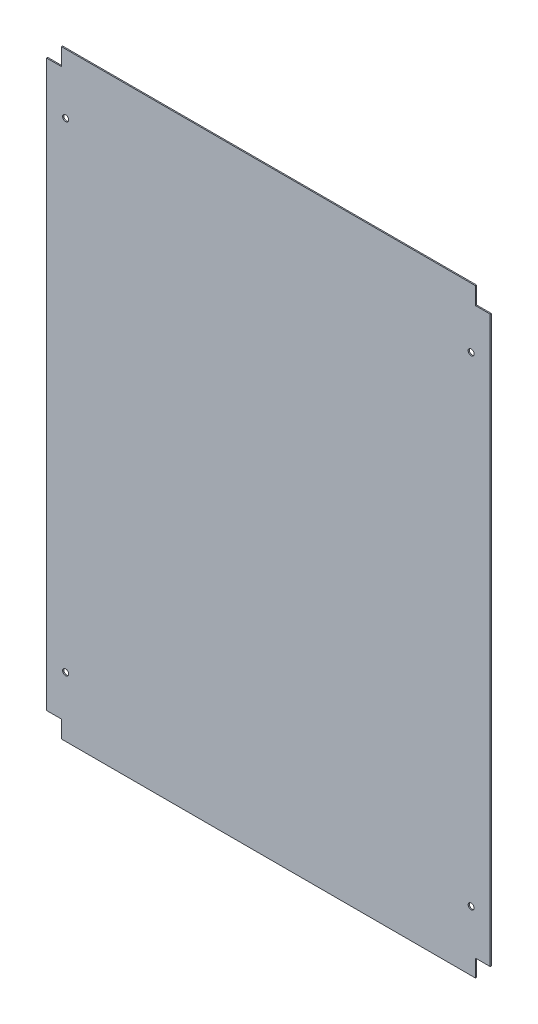
ISO-10303-21;
HEADER;
FILE_DESCRIPTION(('STEP AP214'),'2;1');
FILE_NAME('part.step','',(''),(''),'','','');
FILE_SCHEMA(('AUTOMOTIVE_DESIGN { 1 0 10303 214 1 1 1 1 }'));
ENDSEC;
DATA;
#1=APPLICATION_CONTEXT('core data for automotive mechanical design processes');
#2=APPLICATION_PROTOCOL_DEFINITION('international standard','automotive_design',2000,#1);
#3=PRODUCT_CONTEXT('',#1,'mechanical');
#4=PRODUCT('Part','Part','',(#3));
#5=PRODUCT_RELATED_PRODUCT_CATEGORY('part','',(#4));
#6=PRODUCT_DEFINITION_FORMATION('','',#4);
#7=PRODUCT_DEFINITION_CONTEXT('part definition',#1,'design');
#8=PRODUCT_DEFINITION('design','',#6,#7);
#9=PRODUCT_DEFINITION_SHAPE('','',#8);
#10=(LENGTH_UNIT() NAMED_UNIT(*) SI_UNIT(.MILLI.,.METRE.));
#11=(NAMED_UNIT(*) PLANE_ANGLE_UNIT() SI_UNIT($,.RADIAN.));
#12=(NAMED_UNIT(*) SI_UNIT($,.STERADIAN.) SOLID_ANGLE_UNIT());
#13=UNCERTAINTY_MEASURE_WITH_UNIT(LENGTH_MEASURE(1.E-05),#10,'distance_accuracy_value','');
#14=(GEOMETRIC_REPRESENTATION_CONTEXT(3) GLOBAL_UNCERTAINTY_ASSIGNED_CONTEXT((#13)) GLOBAL_UNIT_ASSIGNED_CONTEXT((#10,
#11,#12)) REPRESENTATION_CONTEXT('',''));
#15=CARTESIAN_POINT('',(0.,0.,0.));
#16=DIRECTION('',(0.,0.,1.));
#17=DIRECTION('',(1.,0.,0.));
#18=AXIS2_PLACEMENT_3D('',#15,#16,#17);
#19=CARTESIAN_POINT('',(0.,0.,-1.524));
#20=DIRECTION('',(0.,0.,-1.));
#21=DIRECTION('',(-1.,0.,0.));
#22=AXIS2_PLACEMENT_3D('',#19,#20,#21);
#23=PLANE('',#22);
#24=CARTESIAN_POINT('',(268.224,317.5,-1.524));
#25=DIRECTION('',(0.,0.,-1.));
#26=DIRECTION('',(-1.,0.,0.));
#27=AXIS2_PLACEMENT_3D('',#24,#25,#26);
#28=CIRCLE('',#27,3.9624);
#29=CARTESIAN_POINT('',(264.2616,317.5,-1.524));
#30=VERTEX_POINT('',#29);
#31=EDGE_CURVE('E385',#30,#30,#28,.T.);
#32=ORIENTED_EDGE('',*,*,#31,.F.);
#33=EDGE_LOOP('',(#32));
#34=FACE_BOUND('',#33,.T.);
#35=CARTESIAN_POINT('',(-268.351,-317.5,-1.524));
#36=DIRECTION('',(0.,0.,-1.));
#37=DIRECTION('',(-1.,0.,0.));
#38=AXIS2_PLACEMENT_3D('',#35,#36,#37);
#39=CIRCLE('',#38,3.9624);
#40=CARTESIAN_POINT('',(-272.3134,-317.5,-1.524));
#41=VERTEX_POINT('',#40);
#42=EDGE_CURVE('E381',#41,#41,#39,.T.);
#43=ORIENTED_EDGE('',*,*,#42,.F.);
#44=EDGE_LOOP('',(#43));
#45=FACE_BOUND('',#44,.T.);
#46=CARTESIAN_POINT('',(268.224,-317.5,-1.524));
#47=DIRECTION('',(0.,0.,-1.));
#48=DIRECTION('',(-1.,0.,0.));
#49=AXIS2_PLACEMENT_3D('',#46,#47,#48);
#50=CIRCLE('',#49,3.9624);
#51=CARTESIAN_POINT('',(264.2616,-317.5,-1.524));
#52=VERTEX_POINT('',#51);
#53=EDGE_CURVE('E377',#52,#52,#50,.T.);
#54=ORIENTED_EDGE('',*,*,#53,.F.);
#55=EDGE_LOOP('',(#54));
#56=FACE_BOUND('',#55,.T.);
#57=CARTESIAN_POINT('',(-268.351,317.5,-1.524));
#58=DIRECTION('',(0.,0.,-1.));
#59=DIRECTION('',(-1.,0.,0.));
#60=AXIS2_PLACEMENT_3D('',#57,#58,#59);
#61=CIRCLE('',#60,3.9624);
#62=CARTESIAN_POINT('',(-272.3134,317.5,-1.524));
#63=VERTEX_POINT('',#62);
#64=EDGE_CURVE('E373',#63,#63,#61,.T.);
#65=ORIENTED_EDGE('',*,*,#64,.F.);
#66=EDGE_LOOP('',(#65));
#67=FACE_BOUND('',#66,.T.);
#68=DIRECTION('',(0.,-1.,0.));
#69=VECTOR('',#68,1.);
#70=CARTESIAN_POINT('',(273.8628,-380.238,-1.524));
#71=LINE('',#70,#69);
#72=CARTESIAN_POINT('',(273.8628,-374.0404,-1.524));
#73=VERTEX_POINT('',#72);
#74=CARTESIAN_POINT('',(273.8628,-396.734962531012,-1.52399999999991));
#75=VERTEX_POINT('',#74);
#76=EDGE_CURVE('E464',#73,#75,#71,.T.);
#77=ORIENTED_EDGE('',*,*,#76,.T.);
#78=DIRECTION('',(-1.,0.,0.));
#79=VECTOR('',#78,1.);
#80=CARTESIAN_POINT('',(273.8628,-396.734962531012,-1.52399999999991));
#81=LINE('',#80,#79);
#82=CARTESIAN_POINT('',(-273.8628,-396.734962531012,-1.52399999999991));
#83=VERTEX_POINT('',#82);
#84=EDGE_CURVE('E330',#83,#75,#81,.F.);
#85=ORIENTED_EDGE('',*,*,#84,.F.);
#86=DIRECTION('',(0.,1.,0.));
#87=VECTOR('',#86,1.);
#88=CARTESIAN_POINT('',(-273.8628,-380.238,-1.524));
#89=LINE('',#88,#87);
#90=CARTESIAN_POINT('',(-273.8628,-374.0404,-1.524));
#91=VERTEX_POINT('',#90);
#92=EDGE_CURVE('E480',#83,#91,#89,.T.);
#93=ORIENTED_EDGE('',*,*,#92,.T.);
#94=DIRECTION('',(-1.,0.,0.));
#95=VECTOR('',#94,1.);
#96=CARTESIAN_POINT('',(-273.7866,-374.0404,-1.52400000000003));
#97=LINE('',#96,#95);
#98=CARTESIAN_POINT('',(-273.7866,-374.0404,-1.524));
#99=VERTEX_POINT('',#98);
#100=EDGE_CURVE('E403',#99,#91,#97,.T.);
#101=ORIENTED_EDGE('',*,*,#100,.F.);
#102=DIRECTION('',(0.,-1.,0.));
#103=VECTOR('',#102,1.);
#104=CARTESIAN_POINT('',(-273.7866,-373.888,-1.52400000000003));
#105=LINE('',#104,#103);
#106=CARTESIAN_POINT('',(-273.7866,-373.888,-1.524));
#107=VERTEX_POINT('',#106);
#108=EDGE_CURVE('E397',#107,#99,#105,.T.);
#109=ORIENTED_EDGE('',*,*,#108,.F.);
#110=DIRECTION('',(-1.,0.,0.));
#111=VECTOR('',#110,1.);
#112=CARTESIAN_POINT('',(-276.987,-373.888,-1.524));
#113=LINE('',#112,#111);
#114=CARTESIAN_POINT('',(-293.483962531012,-373.888,-1.52399999999991));
#115=VERTEX_POINT('',#114);
#116=EDGE_CURVE('E483',#107,#115,#113,.T.);
#117=ORIENTED_EDGE('',*,*,#116,.T.);
#118=DIRECTION('',(0.,1.,0.));
#119=VECTOR('',#118,1.);
#120=CARTESIAN_POINT('',(-293.483962531012,-373.888,-1.52399999999991));
#121=LINE('',#120,#119);
#122=CARTESIAN_POINT('',(-293.483962531012,373.888,-1.5239999999998));
#123=VERTEX_POINT('',#122);
#124=EDGE_CURVE('E313',#123,#115,#121,.F.);
#125=ORIENTED_EDGE('',*,*,#124,.F.);
#126=DIRECTION('',(1.,0.,0.));
#127=VECTOR('',#126,1.);
#128=CARTESIAN_POINT('',(-276.987,373.888,-1.524));
#129=LINE('',#128,#127);
#130=CARTESIAN_POINT('',(-273.7866,373.888,-1.524));
#131=VERTEX_POINT('',#130);
#132=EDGE_CURVE('E160',#123,#131,#129,.T.);
#133=ORIENTED_EDGE('',*,*,#132,.T.);
#134=DIRECTION('',(0.,-1.,0.));
#135=VECTOR('',#134,1.);
#136=CARTESIAN_POINT('',(-273.7866,374.0404,-1.52400000000003));
#137=LINE('',#136,#135);
#138=CARTESIAN_POINT('',(-273.7866,374.0404,-1.524));
#139=VERTEX_POINT('',#138);
#140=EDGE_CURVE('E155',#139,#131,#137,.T.);
#141=ORIENTED_EDGE('',*,*,#140,.F.);
#142=DIRECTION('',(1.,0.,0.));
#143=VECTOR('',#142,1.);
#144=CARTESIAN_POINT('',(-276.987,374.0404,-1.52400000000003));
#145=LINE('',#144,#143);
#146=CARTESIAN_POINT('',(-273.8628,374.0404,-1.524));
#147=VERTEX_POINT('',#146);
#148=EDGE_CURVE('E390',#147,#139,#145,.T.);
#149=ORIENTED_EDGE('',*,*,#148,.F.);
#150=DIRECTION('',(0.,1.,0.));
#151=VECTOR('',#150,1.);
#152=CARTESIAN_POINT('',(-273.8628,380.238,-1.524));
#153=LINE('',#152,#151);
#154=CARTESIAN_POINT('',(-273.8628,396.734962531012,-1.52399999999986));
#155=VERTEX_POINT('',#154);
#156=EDGE_CURVE('E292',#147,#155,#153,.T.);
#157=ORIENTED_EDGE('',*,*,#156,.T.);
#158=DIRECTION('',(1.,0.,0.));
#159=VECTOR('',#158,1.);
#160=CARTESIAN_POINT('',(-273.8628,396.734962531012,-1.52399999999986));
#161=LINE('',#160,#159);
#162=CARTESIAN_POINT('',(273.8628,396.734962531012,-1.52399999999986));
#163=VERTEX_POINT('',#162);
#164=EDGE_CURVE('E290',#163,#155,#161,.F.);
#165=ORIENTED_EDGE('',*,*,#164,.F.);
#166=DIRECTION('',(0.,-1.,0.));
#167=VECTOR('',#166,1.);
#168=CARTESIAN_POINT('',(273.8628,380.238,-1.524));
#169=LINE('',#168,#167);
#170=CARTESIAN_POINT('',(273.8628,374.0404,-1.52399999999998));
#171=VERTEX_POINT('',#170);
#172=EDGE_CURVE('E277',#163,#171,#169,.T.);
#173=ORIENTED_EDGE('',*,*,#172,.T.);
#174=DIRECTION('',(1.,0.,0.));
#175=VECTOR('',#174,1.);
#176=CARTESIAN_POINT('',(273.7866,374.0404,-1.52399999999998));
#177=LINE('',#176,#175);
#178=CARTESIAN_POINT('',(273.7866,374.0404,-1.52399999999998));
#179=VERTEX_POINT('',#178);
#180=EDGE_CURVE('E443',#179,#171,#177,.T.);
#181=ORIENTED_EDGE('',*,*,#180,.F.);
#182=DIRECTION('',(0.,1.,0.));
#183=VECTOR('',#182,1.);
#184=CARTESIAN_POINT('',(273.7866,373.888,-1.52399999999998));
#185=LINE('',#184,#183);
#186=CARTESIAN_POINT('',(273.7866,373.888,-1.52399999999998));
#187=VERTEX_POINT('',#186);
#188=EDGE_CURVE('E437',#187,#179,#185,.T.);
#189=ORIENTED_EDGE('',*,*,#188,.F.);
#190=DIRECTION('',(1.,0.,0.));
#191=VECTOR('',#190,1.);
#192=CARTESIAN_POINT('',(276.987,373.888,-1.524));
#193=LINE('',#192,#191);
#194=CARTESIAN_POINT('',(293.483962531012,373.888,-1.52399999999986));
#195=VERTEX_POINT('',#194);
#196=EDGE_CURVE('E286',#187,#195,#193,.T.);
#197=ORIENTED_EDGE('',*,*,#196,.T.);
#198=DIRECTION('',(0.,-1.,0.));
#199=VECTOR('',#198,1.);
#200=CARTESIAN_POINT('',(293.483962531012,373.888,-1.52399999999986));
#201=LINE('',#200,#199);
#202=CARTESIAN_POINT('',(293.483962531012,-373.888,-1.52399999999986));
#203=VERTEX_POINT('',#202);
#204=EDGE_CURVE('E322',#203,#195,#201,.F.);
#205=ORIENTED_EDGE('',*,*,#204,.F.);
#206=DIRECTION('',(-1.,0.,0.));
#207=VECTOR('',#206,1.);
#208=CARTESIAN_POINT('',(276.987,-373.888,-1.524));
#209=LINE('',#208,#207);
#210=CARTESIAN_POINT('',(273.7866,-373.888,-1.524));
#211=VERTEX_POINT('',#210);
#212=EDGE_CURVE('E492',#203,#211,#209,.T.);
#213=ORIENTED_EDGE('',*,*,#212,.T.);
#214=DIRECTION('',(0.,1.,0.));
#215=VECTOR('',#214,1.);
#216=CARTESIAN_POINT('',(273.7866,-374.0404,-1.52399999999998));
#217=LINE('',#216,#215);
#218=CARTESIAN_POINT('',(273.7866,-374.0404,-1.524));
#219=VERTEX_POINT('',#218);
#220=EDGE_CURVE('E432',#219,#211,#217,.T.);
#221=ORIENTED_EDGE('',*,*,#220,.F.);
#222=DIRECTION('',(-1.,0.,0.));
#223=VECTOR('',#222,1.);
#224=CARTESIAN_POINT('',(276.987,-374.0404,-1.52399999999998));
#225=LINE('',#224,#223);
#226=EDGE_CURVE('E427',#73,#219,#225,.T.);
#227=ORIENTED_EDGE('',*,*,#226,.F.);
#228=EDGE_LOOP('',(#77,#85,#93,#101,#109,#117,#125,#133,#141,#149,#157,#165,#173,#181,#189,#197,
#205,#213,#221,#227));
#229=FACE_BOUND('',#228,.T.);
#230=ADVANCED_FACE('F139',(#34,#45,#56,#67,#229),#23,.T.);
#231=CARTESIAN_POINT('',(0.,0.,0.));
#232=DIRECTION('',(0.,0.,-1.));
#233=DIRECTION('',(-1.,0.,0.));
#234=AXIS2_PLACEMENT_3D('',#231,#232,#233);
#235=PLANE('',#234);
#236=CARTESIAN_POINT('',(268.224,317.5,0.));
#237=DIRECTION('',(0.,0.,1.));
#238=DIRECTION('',(1.,0.,0.));
#239=AXIS2_PLACEMENT_3D('',#236,#237,#238);
#240=CIRCLE('',#239,3.9624);
#241=CARTESIAN_POINT('',(272.1864,317.5,0.));
#242=VERTEX_POINT('',#241);
#243=EDGE_CURVE('E362',#242,#242,#240,.T.);
#244=ORIENTED_EDGE('',*,*,#243,.F.);
#245=EDGE_LOOP('',(#244));
#246=FACE_BOUND('',#245,.T.);
#247=CARTESIAN_POINT('',(-268.351,-317.5,0.));
#248=DIRECTION('',(0.,0.,1.));
#249=DIRECTION('',(1.,0.,0.));
#250=AXIS2_PLACEMENT_3D('',#247,#248,#249);
#251=CIRCLE('',#250,3.9624);
#252=CARTESIAN_POINT('',(-264.3886,-317.5,0.));
#253=VERTEX_POINT('',#252);
#254=EDGE_CURVE('E361',#253,#253,#251,.T.);
#255=ORIENTED_EDGE('',*,*,#254,.F.);
#256=EDGE_LOOP('',(#255));
#257=FACE_BOUND('',#256,.T.);
#258=CARTESIAN_POINT('',(268.224,-317.5,0.));
#259=DIRECTION('',(0.,0.,1.));
#260=DIRECTION('',(1.,0.,0.));
#261=AXIS2_PLACEMENT_3D('',#258,#259,#260);
#262=CIRCLE('',#261,3.9624);
#263=CARTESIAN_POINT('',(272.1864,-317.5,0.));
#264=VERTEX_POINT('',#263);
#265=EDGE_CURVE('E346',#264,#264,#262,.T.);
#266=ORIENTED_EDGE('',*,*,#265,.F.);
#267=EDGE_LOOP('',(#266));
#268=FACE_BOUND('',#267,.T.);
#269=CARTESIAN_POINT('',(-268.351,317.5,0.));
#270=DIRECTION('',(0.,0.,1.));
#271=DIRECTION('',(1.,0.,0.));
#272=AXIS2_PLACEMENT_3D('',#269,#270,#271);
#273=CIRCLE('',#272,3.9624);
#274=CARTESIAN_POINT('',(-264.3886,317.5,0.));
#275=VERTEX_POINT('',#274);
#276=EDGE_CURVE('E366',#275,#275,#273,.T.);
#277=ORIENTED_EDGE('',*,*,#276,.F.);
#278=EDGE_LOOP('',(#277));
#279=FACE_BOUND('',#278,.T.);
#280=DIRECTION('',(0.,1.,0.));
#281=VECTOR('',#280,1.);
#282=CARTESIAN_POINT('',(-273.8628,-380.238,0.));
#283=LINE('',#282,#281);
#284=CARTESIAN_POINT('',(-273.8628,-396.734962531012,1.11022302462516E-13));
#285=VERTEX_POINT('',#284);
#286=CARTESIAN_POINT('',(-273.8628,-374.0404,0.));
#287=VERTEX_POINT('',#286);
#288=EDGE_CURVE('E474',#285,#287,#283,.T.);
#289=ORIENTED_EDGE('',*,*,#288,.F.);
#290=DIRECTION('',(1.,0.,0.));
#291=VECTOR('',#290,1.);
#292=CARTESIAN_POINT('',(0.,-396.734962531012,1.11022302462516E-13));
#293=LINE('',#292,#291);
#294=CARTESIAN_POINT('',(273.8628,-396.734962531012,1.11022302462516E-13));
#295=VERTEX_POINT('',#294);
#296=EDGE_CURVE('E342',#285,#295,#293,.T.);
#297=ORIENTED_EDGE('',*,*,#296,.T.);
#298=DIRECTION('',(0.,-1.,0.));
#299=VECTOR('',#298,1.);
#300=CARTESIAN_POINT('',(273.8628,-380.238,0.));
#301=LINE('',#300,#299);
#302=CARTESIAN_POINT('',(273.8628,-374.0404,0.));
#303=VERTEX_POINT('',#302);
#304=EDGE_CURVE('E489',#303,#295,#301,.T.);
#305=ORIENTED_EDGE('',*,*,#304,.F.);
#306=DIRECTION('',(1.,0.,0.));
#307=VECTOR('',#306,1.);
#308=CARTESIAN_POINT('',(0.,-374.0404,0.));
#309=LINE('',#308,#307);
#310=CARTESIAN_POINT('',(273.7866,-374.0404,0.));
#311=VERTEX_POINT('',#310);
#312=EDGE_CURVE('E431',#311,#303,#309,.T.);
#313=ORIENTED_EDGE('',*,*,#312,.F.);
#314=DIRECTION('',(0.,-1.,0.));
#315=VECTOR('',#314,1.);
#316=CARTESIAN_POINT('',(273.7866,0.,0.));
#317=LINE('',#316,#315);
#318=CARTESIAN_POINT('',(273.7866,-373.888,0.));
#319=VERTEX_POINT('',#318);
#320=EDGE_CURVE('E515',#319,#311,#317,.T.);
#321=ORIENTED_EDGE('',*,*,#320,.F.);
#322=DIRECTION('',(-1.,0.,0.));
#323=VECTOR('',#322,1.);
#324=CARTESIAN_POINT('',(276.987,-373.888,0.));
#325=LINE('',#324,#323);
#326=CARTESIAN_POINT('',(293.483962531012,-373.888,1.66533453693773E-13));
#327=VERTEX_POINT('',#326);
#328=EDGE_CURVE('E486',#327,#319,#325,.T.);
#329=ORIENTED_EDGE('',*,*,#328,.F.);
#330=DIRECTION('',(0.,1.,0.));
#331=VECTOR('',#330,1.);
#332=CARTESIAN_POINT('',(293.483962531012,0.,1.66533453693773E-13));
#333=LINE('',#332,#331);
#334=CARTESIAN_POINT('',(293.483962531012,373.888,1.66533453693773E-13));
#335=VERTEX_POINT('',#334);
#336=EDGE_CURVE('E309',#327,#335,#333,.T.);
#337=ORIENTED_EDGE('',*,*,#336,.T.);
#338=DIRECTION('',(1.,0.,0.));
#339=VECTOR('',#338,1.);
#340=CARTESIAN_POINT('',(276.987,373.888,0.));
#341=LINE('',#340,#339);
#342=CARTESIAN_POINT('',(273.7866,373.888,0.));
#343=VERTEX_POINT('',#342);
#344=EDGE_CURVE('E287',#343,#335,#341,.T.);
#345=ORIENTED_EDGE('',*,*,#344,.F.);
#346=DIRECTION('',(0.,-1.,0.));
#347=VECTOR('',#346,1.);
#348=CARTESIAN_POINT('',(273.7866,0.,0.));
#349=LINE('',#348,#347);
#350=CARTESIAN_POINT('',(273.7866,374.0404,0.));
#351=VERTEX_POINT('',#350);
#352=EDGE_CURVE('E511',#351,#343,#349,.T.);
#353=ORIENTED_EDGE('',*,*,#352,.F.);
#354=DIRECTION('',(-1.,0.,0.));
#355=VECTOR('',#354,1.);
#356=CARTESIAN_POINT('',(0.,374.0404,0.));
#357=LINE('',#356,#355);
#358=CARTESIAN_POINT('',(273.8628,374.0404,0.));
#359=VERTEX_POINT('',#358);
#360=EDGE_CURVE('E461',#359,#351,#357,.T.);
#361=ORIENTED_EDGE('',*,*,#360,.F.);
#362=DIRECTION('',(0.,-1.,0.));
#363=VECTOR('',#362,1.);
#364=CARTESIAN_POINT('',(273.8628,380.238,0.));
#365=LINE('',#364,#363);
#366=CARTESIAN_POINT('',(273.8628,396.734962531012,1.66533453693773E-13));
#367=VERTEX_POINT('',#366);
#368=EDGE_CURVE('E471',#367,#359,#365,.T.);
#369=ORIENTED_EDGE('',*,*,#368,.F.);
#370=DIRECTION('',(-1.,0.,0.));
#371=VECTOR('',#370,1.);
#372=CARTESIAN_POINT('',(0.,396.734962531012,1.66533453693773E-13));
#373=LINE('',#372,#371);
#374=CARTESIAN_POINT('',(-273.8628,396.734962531012,1.66533453693773E-13));
#375=VERTEX_POINT('',#374);
#376=EDGE_CURVE('E301',#367,#375,#373,.T.);
#377=ORIENTED_EDGE('',*,*,#376,.T.);
#378=DIRECTION('',(0.,1.,0.));
#379=VECTOR('',#378,1.);
#380=CARTESIAN_POINT('',(-273.8628,380.238,0.));
#381=LINE('',#380,#379);
#382=CARTESIAN_POINT('',(-273.8628,374.0404,0.));
#383=VERTEX_POINT('',#382);
#384=EDGE_CURVE('E465',#383,#375,#381,.T.);
#385=ORIENTED_EDGE('',*,*,#384,.F.);
#386=DIRECTION('',(-1.,0.,0.));
#387=VECTOR('',#386,1.);
#388=CARTESIAN_POINT('',(0.,374.0404,0.));
#389=LINE('',#388,#387);
#390=CARTESIAN_POINT('',(-273.7866,374.0404,0.));
#391=VERTEX_POINT('',#390);
#392=EDGE_CURVE('E422',#391,#383,#389,.T.);
#393=ORIENTED_EDGE('',*,*,#392,.F.);
#394=DIRECTION('',(0.,1.,0.));
#395=VECTOR('',#394,1.);
#396=CARTESIAN_POINT('',(-273.7866,0.,0.));
#397=LINE('',#396,#395);
#398=CARTESIAN_POINT('',(-273.7866,373.888,0.));
#399=VERTEX_POINT('',#398);
#400=EDGE_CURVE('E13',#399,#391,#397,.T.);
#401=ORIENTED_EDGE('',*,*,#400,.F.);
#402=DIRECTION('',(1.,0.,0.));
#403=VECTOR('',#402,1.);
#404=CARTESIAN_POINT('',(-276.987,373.888,0.));
#405=LINE('',#404,#403);
#406=CARTESIAN_POINT('',(-293.483962531012,373.888,2.22044604925031E-13));
#407=VERTEX_POINT('',#406);
#408=EDGE_CURVE('E468',#407,#399,#405,.T.);
#409=ORIENTED_EDGE('',*,*,#408,.F.);
#410=DIRECTION('',(0.,-1.,0.));
#411=VECTOR('',#410,1.);
#412=CARTESIAN_POINT('',(-293.483962531012,0.,1.66533453693773E-13));
#413=LINE('',#412,#411);
#414=CARTESIAN_POINT('',(-293.483962531012,-373.888,1.11022302462516E-13));
#415=VERTEX_POINT('',#414);
#416=EDGE_CURVE('E326',#407,#415,#413,.T.);
#417=ORIENTED_EDGE('',*,*,#416,.T.);
#418=DIRECTION('',(-1.,0.,0.));
#419=VECTOR('',#418,1.);
#420=CARTESIAN_POINT('',(-276.987,-373.888,0.));
#421=LINE('',#420,#419);
#422=CARTESIAN_POINT('',(-273.7866,-373.888,0.));
#423=VERTEX_POINT('',#422);
#424=EDGE_CURVE('E477',#423,#415,#421,.T.);
#425=ORIENTED_EDGE('',*,*,#424,.F.);
#426=DIRECTION('',(0.,1.,0.));
#427=VECTOR('',#426,1.);
#428=CARTESIAN_POINT('',(-273.7866,0.,0.));
#429=LINE('',#428,#427);
#430=CARTESIAN_POINT('',(-273.7866,-374.0404,0.));
#431=VERTEX_POINT('',#430);
#432=EDGE_CURVE('E148',#431,#423,#429,.T.);
#433=ORIENTED_EDGE('',*,*,#432,.F.);
#434=DIRECTION('',(1.,0.,0.));
#435=VECTOR('',#434,1.);
#436=CARTESIAN_POINT('',(0.,-374.0404,0.));
#437=LINE('',#436,#435);
#438=EDGE_CURVE('E393',#287,#431,#437,.T.);
#439=ORIENTED_EDGE('',*,*,#438,.F.);
#440=EDGE_LOOP('',(#289,#297,#305,#313,#321,#329,#337,#345,#353,#361,#369,#377,#385,#393,#401,
#409,#417,#425,#433,#439));
#441=FACE_BOUND('',#440,.T.);
#442=ADVANCED_FACE('F141',(#246,#257,#268,#279,#441),#235,.F.);
#443=CARTESIAN_POINT('',(-273.8628,-380.238,-1.524));
#444=DIRECTION('',(1.,0.,0.));
#445=DIRECTION('',(0.,0.,-1.));
#446=AXIS2_PLACEMENT_3D('',#443,#444,#445);
#447=PLANE('',#446);
#448=ORIENTED_EDGE('',*,*,#92,.F.);
#449=DIRECTION('',(0.,0.,-1.));
#450=VECTOR('',#449,1.);
#451=CARTESIAN_POINT('',(-273.8628,-396.734962531012,1.11022302462516E-13));
#452=LINE('',#451,#450);
#453=EDGE_CURVE('E351',#285,#83,#452,.T.);
#454=ORIENTED_EDGE('',*,*,#453,.F.);
#455=ORIENTED_EDGE('',*,*,#288,.T.);
#456=DIRECTION('',(0.,0.,1.));
#457=VECTOR('',#456,1.);
#458=CARTESIAN_POINT('',(-273.8628,-374.0404,-1.524));
#459=LINE('',#458,#457);
#460=EDGE_CURVE('E519',#91,#287,#459,.T.);
#461=ORIENTED_EDGE('',*,*,#460,.F.);
#462=EDGE_LOOP('',(#448,#454,#455,#461));
#463=FACE_BOUND('',#462,.T.);
#464=ADVANCED_FACE('F549',(#463),#447,.F.);
#465=CARTESIAN_POINT('',(273.8628,-380.238,-1.524));
#466=DIRECTION('',(-1.,0.,0.));
#467=DIRECTION('',(0.,-1.,0.));
#468=AXIS2_PLACEMENT_3D('',#465,#466,#467);
#469=PLANE('',#468);
#470=ORIENTED_EDGE('',*,*,#304,.T.);
#471=DIRECTION('',(0.,0.,-1.));
#472=VECTOR('',#471,1.);
#473=CARTESIAN_POINT('',(273.8628,-396.734962531012,1.11022302462516E-13));
#474=LINE('',#473,#472);
#475=EDGE_CURVE('E347',#295,#75,#474,.T.);
#476=ORIENTED_EDGE('',*,*,#475,.T.);
#477=ORIENTED_EDGE('',*,*,#76,.F.);
#478=DIRECTION('',(0.,0.,-1.));
#479=VECTOR('',#478,1.);
#480=CARTESIAN_POINT('',(273.8628,-374.0404,-1.524));
#481=LINE('',#480,#479);
#482=EDGE_CURVE('E501',#303,#73,#481,.T.);
#483=ORIENTED_EDGE('',*,*,#482,.F.);
#484=EDGE_LOOP('',(#470,#476,#477,#483));
#485=FACE_BOUND('',#484,.T.);
#486=ADVANCED_FACE('F552',(#485),#469,.F.);
#487=CARTESIAN_POINT('',(-273.8628,380.238,-1.524));
#488=DIRECTION('',(1.,0.,0.));
#489=DIRECTION('',(0.,1.,0.));
#490=AXIS2_PLACEMENT_3D('',#487,#488,#489);
#491=PLANE('',#490);
#492=DIRECTION('',(0.,0.,-1.));
#493=VECTOR('',#492,1.);
#494=CARTESIAN_POINT('',(-273.8628,374.0404,-1.524));
#495=LINE('',#494,#493);
#496=EDGE_CURVE('E523',#383,#147,#495,.T.);
#497=ORIENTED_EDGE('',*,*,#496,.F.);
#498=ORIENTED_EDGE('',*,*,#384,.T.);
#499=DIRECTION('',(0.,0.,-1.));
#500=VECTOR('',#499,1.);
#501=CARTESIAN_POINT('',(-273.8628,396.734962531012,1.11022302462516E-13));
#502=LINE('',#501,#500);
#503=EDGE_CURVE('E303',#375,#155,#502,.T.);
#504=ORIENTED_EDGE('',*,*,#503,.T.);
#505=ORIENTED_EDGE('',*,*,#156,.F.);
#506=EDGE_LOOP('',(#497,#498,#504,#505));
#507=FACE_BOUND('',#506,.T.);
#508=ADVANCED_FACE('F581',(#507),#491,.F.);
#509=CARTESIAN_POINT('',(-276.987,373.888,-1.524));
#510=DIRECTION('',(0.,-1.,0.));
#511=DIRECTION('',(1.,0.,0.));
#512=AXIS2_PLACEMENT_3D('',#509,#510,#511);
#513=PLANE('',#512);
#514=ORIENTED_EDGE('',*,*,#132,.F.);
#515=DIRECTION('',(0.,0.,-1.));
#516=VECTOR('',#515,1.);
#517=CARTESIAN_POINT('',(-293.483962531012,373.888,2.22044604925031E-13));
#518=LINE('',#517,#516);
#519=EDGE_CURVE('E335',#407,#123,#518,.T.);
#520=ORIENTED_EDGE('',*,*,#519,.F.);
#521=ORIENTED_EDGE('',*,*,#408,.T.);
#522=DIRECTION('',(0.,0.,1.));
#523=VECTOR('',#522,1.);
#524=CARTESIAN_POINT('',(-273.7866,373.888,-1.52400000000003));
#525=LINE('',#524,#523);
#526=EDGE_CURVE('E401',#131,#399,#525,.T.);
#527=ORIENTED_EDGE('',*,*,#526,.F.);
#528=EDGE_LOOP('',(#514,#520,#521,#527));
#529=FACE_BOUND('',#528,.T.);
#530=ADVANCED_FACE('F589',(#529),#513,.F.);
#531=CARTESIAN_POINT('',(-276.987,-373.888,-1.524));
#532=DIRECTION('',(0.,1.,0.));
#533=DIRECTION('',(0.,0.,1.));
#534=AXIS2_PLACEMENT_3D('',#531,#532,#533);
#535=PLANE('',#534);
#536=ORIENTED_EDGE('',*,*,#424,.T.);
#537=DIRECTION('',(0.,0.,-1.));
#538=VECTOR('',#537,1.);
#539=CARTESIAN_POINT('',(-293.483962531012,-373.888,1.11022302462516E-13));
#540=LINE('',#539,#538);
#541=EDGE_CURVE('E331',#415,#115,#540,.T.);
#542=ORIENTED_EDGE('',*,*,#541,.T.);
#543=ORIENTED_EDGE('',*,*,#116,.F.);
#544=DIRECTION('',(0.,0.,1.));
#545=VECTOR('',#544,1.);
#546=CARTESIAN_POINT('',(-273.7866,-373.888,-1.52400000000003));
#547=LINE('',#546,#545);
#548=EDGE_CURVE('E402',#107,#423,#547,.T.);
#549=ORIENTED_EDGE('',*,*,#548,.T.);
#550=EDGE_LOOP('',(#536,#542,#543,#549));
#551=FACE_BOUND('',#550,.T.);
#552=ADVANCED_FACE('F535',(#551),#535,.F.);
#553=CARTESIAN_POINT('',(273.8628,380.238,-1.524));
#554=DIRECTION('',(-1.,0.,0.));
#555=DIRECTION('',(0.,0.,1.));
#556=AXIS2_PLACEMENT_3D('',#553,#554,#555);
#557=PLANE('',#556);
#558=DIRECTION('',(0.,0.,1.));
#559=VECTOR('',#558,1.);
#560=CARTESIAN_POINT('',(273.8628,374.0404,-1.524));
#561=LINE('',#560,#559);
#562=EDGE_CURVE('E283',#171,#359,#561,.T.);
#563=ORIENTED_EDGE('',*,*,#562,.F.);
#564=ORIENTED_EDGE('',*,*,#172,.F.);
#565=DIRECTION('',(0.,0.,-1.));
#566=VECTOR('',#565,1.);
#567=CARTESIAN_POINT('',(273.8628,396.734962531012,1.66533453693773E-13));
#568=LINE('',#567,#566);
#569=EDGE_CURVE('E282',#367,#163,#568,.T.);
#570=ORIENTED_EDGE('',*,*,#569,.F.);
#571=ORIENTED_EDGE('',*,*,#368,.T.);
#572=EDGE_LOOP('',(#563,#564,#570,#571));
#573=FACE_BOUND('',#572,.T.);
#574=ADVANCED_FACE('F279',(#573),#557,.F.);
#575=CARTESIAN_POINT('',(276.987,373.888,-1.524));
#576=DIRECTION('',(0.,-1.,0.));
#577=DIRECTION('',(0.,0.,-1.));
#578=AXIS2_PLACEMENT_3D('',#575,#576,#577);
#579=PLANE('',#578);
#580=ORIENTED_EDGE('',*,*,#344,.T.);
#581=DIRECTION('',(0.,0.,-1.));
#582=VECTOR('',#581,1.);
#583=CARTESIAN_POINT('',(293.483962531012,373.888,1.11022302462516E-13));
#584=LINE('',#583,#582);
#585=EDGE_CURVE('E314',#335,#195,#584,.T.);
#586=ORIENTED_EDGE('',*,*,#585,.T.);
#587=ORIENTED_EDGE('',*,*,#196,.F.);
#588=DIRECTION('',(0.,0.,1.));
#589=VECTOR('',#588,1.);
#590=CARTESIAN_POINT('',(273.7866,373.888,-1.52399999999998));
#591=LINE('',#590,#589);
#592=EDGE_CURVE('E442',#187,#343,#591,.T.);
#593=ORIENTED_EDGE('',*,*,#592,.T.);
#594=EDGE_LOOP('',(#580,#586,#587,#593));
#595=FACE_BOUND('',#594,.T.);
#596=ADVANCED_FACE('F570',(#595),#579,.F.);
#597=CARTESIAN_POINT('',(276.987,-373.888,-1.524));
#598=DIRECTION('',(0.,1.,0.));
#599=DIRECTION('',(0.,0.,1.));
#600=AXIS2_PLACEMENT_3D('',#597,#598,#599);
#601=PLANE('',#600);
#602=ORIENTED_EDGE('',*,*,#212,.F.);
#603=DIRECTION('',(0.,0.,-1.));
#604=VECTOR('',#603,1.);
#605=CARTESIAN_POINT('',(293.483962531012,-373.888,1.66533453693773E-13));
#606=LINE('',#605,#604);
#607=EDGE_CURVE('E318',#327,#203,#606,.T.);
#608=ORIENTED_EDGE('',*,*,#607,.F.);
#609=ORIENTED_EDGE('',*,*,#328,.T.);
#610=DIRECTION('',(0.,0.,1.));
#611=VECTOR('',#610,1.);
#612=CARTESIAN_POINT('',(273.7866,-373.888,-1.52399999999998));
#613=LINE('',#612,#611);
#614=EDGE_CURVE('E441',#211,#319,#613,.T.);
#615=ORIENTED_EDGE('',*,*,#614,.F.);
#616=EDGE_LOOP('',(#602,#608,#609,#615));
#617=FACE_BOUND('',#616,.T.);
#618=ADVANCED_FACE('F566',(#617),#601,.F.);
#619=CARTESIAN_POINT('',(276.987,-374.0404,-1.52399999999998));
#620=DIRECTION('',(0.,1.,0.));
#621=DIRECTION('',(0.,0.,1.));
#622=AXIS2_PLACEMENT_3D('',#619,#620,#621);
#623=PLANE('',#622);
#624=DIRECTION('',(0.,0.,1.));
#625=VECTOR('',#624,1.);
#626=CARTESIAN_POINT('',(273.7866,-374.0404,-1.52399999999998));
#627=LINE('',#626,#625);
#628=EDGE_CURVE('E436',#219,#311,#627,.T.);
#629=ORIENTED_EDGE('',*,*,#628,.T.);
#630=ORIENTED_EDGE('',*,*,#312,.T.);
#631=ORIENTED_EDGE('',*,*,#482,.T.);
#632=ORIENTED_EDGE('',*,*,#226,.T.);
#633=EDGE_LOOP('',(#629,#630,#631,#632));
#634=FACE_BOUND('',#633,.T.);
#635=ADVANCED_FACE('F555',(#634),#623,.T.);
#636=CARTESIAN_POINT('',(273.7866,-374.0404,-1.52399999999998));
#637=DIRECTION('',(1.,0.,0.));
#638=DIRECTION('',(0.,0.,-1.));
#639=AXIS2_PLACEMENT_3D('',#636,#637,#638);
#640=PLANE('',#639);
#641=ORIENTED_EDGE('',*,*,#614,.T.);
#642=ORIENTED_EDGE('',*,*,#320,.T.);
#643=ORIENTED_EDGE('',*,*,#628,.F.);
#644=ORIENTED_EDGE('',*,*,#220,.T.);
#645=EDGE_LOOP('',(#641,#642,#643,#644));
#646=FACE_BOUND('',#645,.T.);
#647=ADVANCED_FACE('F558',(#646),#640,.T.);
#648=CARTESIAN_POINT('',(273.7866,373.888,-1.52399999999998));
#649=DIRECTION('',(1.,0.,0.));
#650=DIRECTION('',(0.,0.,-1.));
#651=AXIS2_PLACEMENT_3D('',#648,#649,#650);
#652=PLANE('',#651);
#653=DIRECTION('',(0.,0.,1.));
#654=VECTOR('',#653,1.);
#655=CARTESIAN_POINT('',(273.7866,374.0404,-1.52399999999998));
#656=LINE('',#655,#654);
#657=EDGE_CURVE('E426',#179,#351,#656,.T.);
#658=ORIENTED_EDGE('',*,*,#657,.T.);
#659=ORIENTED_EDGE('',*,*,#352,.T.);
#660=ORIENTED_EDGE('',*,*,#592,.F.);
#661=ORIENTED_EDGE('',*,*,#188,.T.);
#662=EDGE_LOOP('',(#658,#659,#660,#661));
#663=FACE_BOUND('',#662,.T.);
#664=ADVANCED_FACE('F575',(#663),#652,.T.);
#665=CARTESIAN_POINT('',(273.7866,374.0404,-1.52399999999998));
#666=DIRECTION('',(0.,-1.,0.));
#667=DIRECTION('',(0.,0.,-1.));
#668=AXIS2_PLACEMENT_3D('',#665,#666,#667);
#669=PLANE('',#668);
#670=ORIENTED_EDGE('',*,*,#562,.T.);
#671=ORIENTED_EDGE('',*,*,#360,.T.);
#672=ORIENTED_EDGE('',*,*,#657,.F.);
#673=ORIENTED_EDGE('',*,*,#180,.T.);
#674=EDGE_LOOP('',(#670,#671,#672,#673));
#675=FACE_BOUND('',#674,.T.);
#676=ADVANCED_FACE('F577',(#675),#669,.T.);
#677=CARTESIAN_POINT('',(-273.7866,-374.0404,-1.52400000000003));
#678=DIRECTION('',(0.,1.,0.));
#679=DIRECTION('',(0.,0.,1.));
#680=AXIS2_PLACEMENT_3D('',#677,#678,#679);
#681=PLANE('',#680);
#682=ORIENTED_EDGE('',*,*,#460,.T.);
#683=ORIENTED_EDGE('',*,*,#438,.T.);
#684=DIRECTION('',(0.,0.,1.));
#685=VECTOR('',#684,1.);
#686=CARTESIAN_POINT('',(-273.7866,-374.0404,-1.52400000000003));
#687=LINE('',#686,#685);
#688=EDGE_CURVE('E389',#99,#431,#687,.T.);
#689=ORIENTED_EDGE('',*,*,#688,.F.);
#690=ORIENTED_EDGE('',*,*,#100,.T.);
#691=EDGE_LOOP('',(#682,#683,#689,#690));
#692=FACE_BOUND('',#691,.T.);
#693=ADVANCED_FACE('F541',(#692),#681,.T.);
#694=CARTESIAN_POINT('',(-273.7866,-373.888,-1.52400000000003));
#695=DIRECTION('',(-1.,0.,0.));
#696=DIRECTION('',(0.,0.,1.));
#697=AXIS2_PLACEMENT_3D('',#694,#695,#696);
#698=PLANE('',#697);
#699=ORIENTED_EDGE('',*,*,#688,.T.);
#700=ORIENTED_EDGE('',*,*,#432,.T.);
#701=ORIENTED_EDGE('',*,*,#548,.F.);
#702=ORIENTED_EDGE('',*,*,#108,.T.);
#703=EDGE_LOOP('',(#699,#700,#701,#702));
#704=FACE_BOUND('',#703,.T.);
#705=ADVANCED_FACE('F530',(#704),#698,.T.);
#706=CARTESIAN_POINT('',(-273.7866,374.0404,-1.52400000000003));
#707=DIRECTION('',(-1.,0.,0.));
#708=DIRECTION('',(0.,0.,1.));
#709=AXIS2_PLACEMENT_3D('',#706,#707,#708);
#710=PLANE('',#709);
#711=ORIENTED_EDGE('',*,*,#526,.T.);
#712=ORIENTED_EDGE('',*,*,#400,.T.);
#713=DIRECTION('',(0.,0.,1.));
#714=VECTOR('',#713,1.);
#715=CARTESIAN_POINT('',(-273.7866,374.0404,-1.52400000000003));
#716=LINE('',#715,#714);
#717=EDGE_CURVE('E396',#139,#391,#716,.T.);
#718=ORIENTED_EDGE('',*,*,#717,.F.);
#719=ORIENTED_EDGE('',*,*,#140,.T.);
#720=EDGE_LOOP('',(#711,#712,#718,#719));
#721=FACE_BOUND('',#720,.T.);
#722=ADVANCED_FACE('F587',(#721),#710,.T.);
#723=CARTESIAN_POINT('',(-276.987,374.0404,-1.52400000000003));
#724=DIRECTION('',(0.,-1.,0.));
#725=DIRECTION('',(0.,0.,-1.));
#726=AXIS2_PLACEMENT_3D('',#723,#724,#725);
#727=PLANE('',#726);
#728=ORIENTED_EDGE('',*,*,#717,.T.);
#729=ORIENTED_EDGE('',*,*,#392,.T.);
#730=ORIENTED_EDGE('',*,*,#496,.T.);
#731=ORIENTED_EDGE('',*,*,#148,.T.);
#732=EDGE_LOOP('',(#728,#729,#730,#731));
#733=FACE_BOUND('',#732,.T.);
#734=ADVANCED_FACE('F583',(#733),#727,.T.);
#735=CARTESIAN_POINT('',(-268.351,317.5,-19.05));
#736=DIRECTION('',(0.,0.,1.));
#737=DIRECTION('',(1.,0.,0.));
#738=AXIS2_PLACEMENT_3D('',#735,#736,#737);
#739=CYLINDRICAL_SURFACE('',#738,3.9624);
#740=ORIENTED_EDGE('',*,*,#64,.T.);
#741=EDGE_LOOP('',(#740));
#742=FACE_BOUND('',#741,.T.);
#743=ORIENTED_EDGE('',*,*,#276,.T.);
#744=EDGE_LOOP('',(#743));
#745=FACE_BOUND('',#744,.T.);
#746=ADVANCED_FACE('F638',(#742,#745),#739,.F.);
#747=CARTESIAN_POINT('',(268.224,-317.5,-19.05));
#748=DIRECTION('',(0.,0.,1.));
#749=DIRECTION('',(1.,0.,0.));
#750=AXIS2_PLACEMENT_3D('',#747,#748,#749);
#751=CYLINDRICAL_SURFACE('',#750,3.9624);
#752=ORIENTED_EDGE('',*,*,#53,.T.);
#753=EDGE_LOOP('',(#752));
#754=FACE_BOUND('',#753,.T.);
#755=ORIENTED_EDGE('',*,*,#265,.T.);
#756=EDGE_LOOP('',(#755));
#757=FACE_BOUND('',#756,.T.);
#758=ADVANCED_FACE('F647',(#754,#757),#751,.F.);
#759=CARTESIAN_POINT('',(-268.351,-317.5,-19.05));
#760=DIRECTION('',(0.,0.,1.));
#761=DIRECTION('',(1.,0.,0.));
#762=AXIS2_PLACEMENT_3D('',#759,#760,#761);
#763=CYLINDRICAL_SURFACE('',#762,3.9624);
#764=ORIENTED_EDGE('',*,*,#42,.T.);
#765=EDGE_LOOP('',(#764));
#766=FACE_BOUND('',#765,.T.);
#767=ORIENTED_EDGE('',*,*,#254,.T.);
#768=EDGE_LOOP('',(#767));
#769=FACE_BOUND('',#768,.T.);
#770=ADVANCED_FACE('F649',(#766,#769),#763,.F.);
#771=CARTESIAN_POINT('',(268.224,317.5,-19.05));
#772=DIRECTION('',(0.,0.,1.));
#773=DIRECTION('',(1.,0.,0.));
#774=AXIS2_PLACEMENT_3D('',#771,#772,#773);
#775=CYLINDRICAL_SURFACE('',#774,3.9624);
#776=ORIENTED_EDGE('',*,*,#31,.T.);
#777=EDGE_LOOP('',(#776));
#778=FACE_BOUND('',#777,.T.);
#779=ORIENTED_EDGE('',*,*,#243,.T.);
#780=EDGE_LOOP('',(#779));
#781=FACE_BOUND('',#780,.T.);
#782=ADVANCED_FACE('F601',(#778,#781),#775,.F.);
#783=CARTESIAN_POINT('',(273.8628,-396.734962531012,1.11022302462516E-13));
#784=DIRECTION('',(0.,1.,0.));
#785=DIRECTION('',(0.,0.,1.));
#786=AXIS2_PLACEMENT_3D('',#783,#784,#785);
#787=PLANE('',#786);
#788=ORIENTED_EDGE('',*,*,#84,.T.);
#789=ORIENTED_EDGE('',*,*,#475,.F.);
#790=ORIENTED_EDGE('',*,*,#296,.F.);
#791=ORIENTED_EDGE('',*,*,#453,.T.);
#792=EDGE_LOOP('',(#788,#789,#790,#791));
#793=FACE_BOUND('',#792,.T.);
#794=ADVANCED_FACE('F548',(#793),#787,.F.);
#795=CARTESIAN_POINT('',(-293.483962531012,-373.888,1.11022302462516E-13));
#796=DIRECTION('',(1.,0.,0.));
#797=DIRECTION('',(0.,0.,-1.));
#798=AXIS2_PLACEMENT_3D('',#795,#796,#797);
#799=PLANE('',#798);
#800=ORIENTED_EDGE('',*,*,#124,.T.);
#801=ORIENTED_EDGE('',*,*,#541,.F.);
#802=ORIENTED_EDGE('',*,*,#416,.F.);
#803=ORIENTED_EDGE('',*,*,#519,.T.);
#804=EDGE_LOOP('',(#800,#801,#802,#803));
#805=FACE_BOUND('',#804,.T.);
#806=ADVANCED_FACE('F593',(#805),#799,.F.);
#807=CARTESIAN_POINT('',(293.483962531012,373.888,1.11022302462516E-13));
#808=DIRECTION('',(-1.,0.,0.));
#809=DIRECTION('',(0.,0.,1.));
#810=AXIS2_PLACEMENT_3D('',#807,#808,#809);
#811=PLANE('',#810);
#812=ORIENTED_EDGE('',*,*,#204,.T.);
#813=ORIENTED_EDGE('',*,*,#585,.F.);
#814=ORIENTED_EDGE('',*,*,#336,.F.);
#815=ORIENTED_EDGE('',*,*,#607,.T.);
#816=EDGE_LOOP('',(#812,#813,#814,#815));
#817=FACE_BOUND('',#816,.T.);
#818=ADVANCED_FACE('F565',(#817),#811,.F.);
#819=CARTESIAN_POINT('',(-273.8628,396.734962531012,1.11022302462516E-13));
#820=DIRECTION('',(0.,-1.,0.));
#821=DIRECTION('',(0.,0.,-1.));
#822=AXIS2_PLACEMENT_3D('',#819,#820,#821);
#823=PLANE('',#822);
#824=ORIENTED_EDGE('',*,*,#164,.T.);
#825=ORIENTED_EDGE('',*,*,#503,.F.);
#826=ORIENTED_EDGE('',*,*,#376,.F.);
#827=ORIENTED_EDGE('',*,*,#569,.T.);
#828=EDGE_LOOP('',(#824,#825,#826,#827));
#829=FACE_BOUND('',#828,.T.);
#830=ADVANCED_FACE('F299',(#829),#823,.F.);
#831=CLOSED_SHELL('',(#230,#442,#464,#486,#508,#530,#552,#574,#596,#618,#635,#647,#664,#676,
#693,#705,#722,#734,#746,#758,#770,#782,#794,#806,#818,#830));
#832=MANIFOLD_SOLID_BREP('B2',#831);
#833=ADVANCED_BREP_SHAPE_REPRESENTATION('',(#18,#832),#14);
#834=SHAPE_DEFINITION_REPRESENTATION(#9,#833);
ENDSEC;
END-ISO-10303-21;
